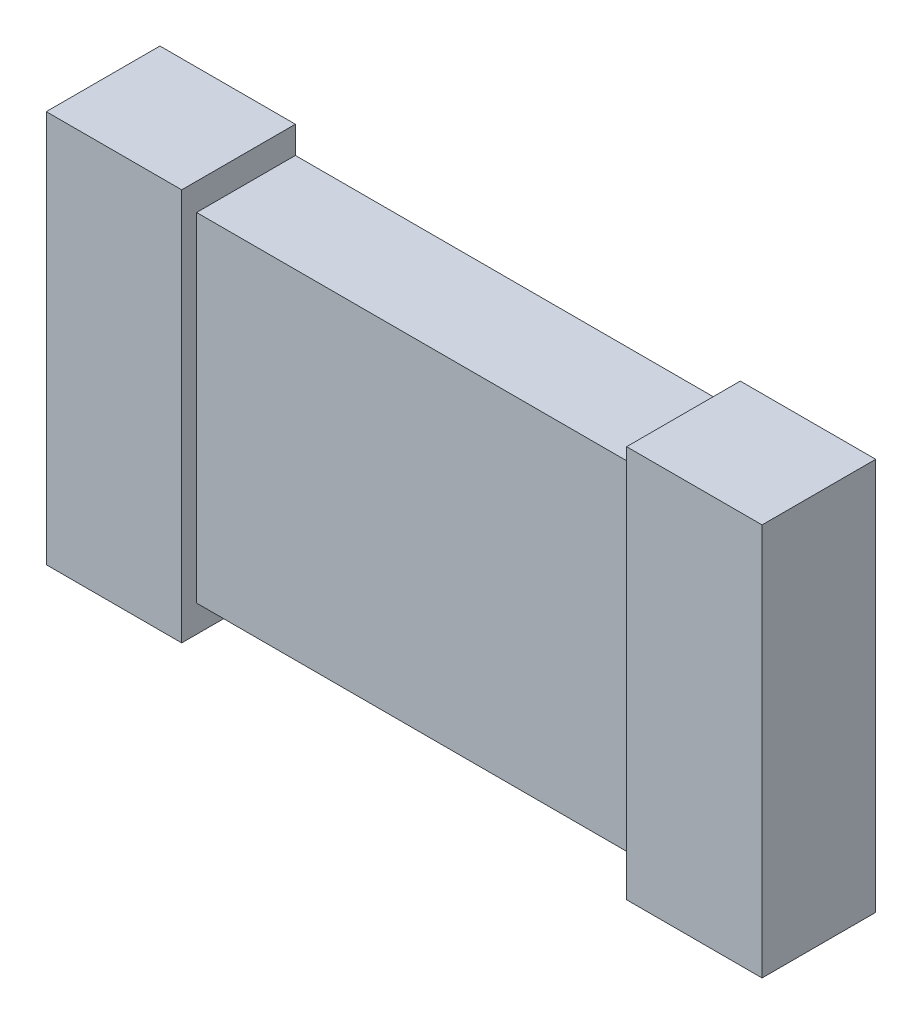
ISO-10303-21;
HEADER;
FILE_DESCRIPTION(('STEP AP214'),'2;1');
FILE_NAME('part.step','',(''),(''),'','','');
FILE_SCHEMA(('AUTOMOTIVE_DESIGN { 1 0 10303 214 1 1 1 1 }'));
ENDSEC;
DATA;
#1=APPLICATION_CONTEXT('core data for automotive mechanical design processes');
#2=APPLICATION_PROTOCOL_DEFINITION('international standard','automotive_design',2000,#1);
#3=PRODUCT_CONTEXT('',#1,'mechanical');
#4=PRODUCT('Part','Part','',(#3));
#5=PRODUCT_RELATED_PRODUCT_CATEGORY('part','',(#4));
#6=PRODUCT_DEFINITION_FORMATION('','',#4);
#7=PRODUCT_DEFINITION_CONTEXT('part definition',#1,'design');
#8=PRODUCT_DEFINITION('design','',#6,#7);
#9=PRODUCT_DEFINITION_SHAPE('','',#8);
#10=(LENGTH_UNIT() NAMED_UNIT(*) SI_UNIT(.MILLI.,.METRE.));
#11=(NAMED_UNIT(*) PLANE_ANGLE_UNIT() SI_UNIT($,.RADIAN.));
#12=(NAMED_UNIT(*) SI_UNIT($,.STERADIAN.) SOLID_ANGLE_UNIT());
#13=UNCERTAINTY_MEASURE_WITH_UNIT(LENGTH_MEASURE(1.E-05),#10,'distance_accuracy_value','');
#14=(GEOMETRIC_REPRESENTATION_CONTEXT(3) GLOBAL_UNCERTAINTY_ASSIGNED_CONTEXT((#13)) GLOBAL_UNIT_ASSIGNED_CONTEXT((#10,
#11,#12)) REPRESENTATION_CONTEXT('',''));
#15=CARTESIAN_POINT('',(0.,0.,0.));
#16=DIRECTION('',(0.,0.,1.));
#17=DIRECTION('',(1.,0.,0.));
#18=AXIS2_PLACEMENT_3D('',#15,#16,#17);
#19=CARTESIAN_POINT('',(50.24063,34.316,-1.6327145543379));
#20=DIRECTION('',(1.,0.,0.));
#21=DIRECTION('',(0.,1.,0.));
#22=AXIS2_PLACEMENT_3D('',#19,#20,#21);
#23=PLANE('',#22);
#24=DIRECTION('',(0.,0.,1.));
#25=VECTOR('',#24,1.);
#26=CARTESIAN_POINT('',(50.24063,33.56,-1.6327145543379));
#27=LINE('',#26,#25);
#28=CARTESIAN_POINT('',(50.24063,33.56,0.5302));
#29=VERTEX_POINT('',#28);
#30=CARTESIAN_POINT('',(50.24063,33.56,0.000999999999999265));
#31=VERTEX_POINT('',#30);
#32=EDGE_CURVE('E133',#29,#31,#27,.F.);
#33=ORIENTED_EDGE('',*,*,#32,.T.);
#34=DIRECTION('',(0.,1.,0.));
#35=VECTOR('',#34,1.);
#36=CARTESIAN_POINT('',(50.24063,34.316,0.000999999999999265));
#37=LINE('',#36,#35);
#38=CARTESIAN_POINT('',(50.24063,33.686,0.000999999999999265));
#39=VERTEX_POINT('',#38);
#40=EDGE_CURVE('E103',#31,#39,#37,.T.);
#41=ORIENTED_EDGE('',*,*,#40,.T.);
#42=DIRECTION('',(0.,0.,1.));
#43=VECTOR('',#42,1.);
#44=CARTESIAN_POINT('',(50.24063,33.686,-1.6327145543379));
#45=LINE('',#44,#43);
#46=CARTESIAN_POINT('',(50.24063,33.686,0.4609));
#47=VERTEX_POINT('',#46);
#48=EDGE_CURVE('E20',#39,#47,#45,.T.);
#49=ORIENTED_EDGE('',*,*,#48,.T.);
#50=DIRECTION('',(0.,1.,0.));
#51=VECTOR('',#50,1.);
#52=CARTESIAN_POINT('',(50.24063,34.316,0.4609));
#53=LINE('',#52,#51);
#54=CARTESIAN_POINT('',(50.24063,35.261,0.4609));
#55=VERTEX_POINT('',#54);
#56=EDGE_CURVE('E108',#47,#55,#53,.T.);
#57=ORIENTED_EDGE('',*,*,#56,.T.);
#58=DIRECTION('',(0.,0.,1.));
#59=VECTOR('',#58,1.);
#60=CARTESIAN_POINT('',(50.24063,35.261,-1.6327145543379));
#61=LINE('',#60,#59);
#62=CARTESIAN_POINT('',(50.24063,35.261,0.000999999999999265));
#63=VERTEX_POINT('',#62);
#64=EDGE_CURVE('E126',#55,#63,#61,.F.);
#65=ORIENTED_EDGE('',*,*,#64,.T.);
#66=DIRECTION('',(0.,1.,0.));
#67=VECTOR('',#66,1.);
#68=CARTESIAN_POINT('',(50.24063,34.316,0.000999999999999265));
#69=LINE('',#68,#67);
#70=CARTESIAN_POINT('',(50.24063,35.387,0.000999999999999265));
#71=VERTEX_POINT('',#70);
#72=EDGE_CURVE('E127',#63,#71,#69,.T.);
#73=ORIENTED_EDGE('',*,*,#72,.T.);
#74=DIRECTION('',(0.,0.,1.));
#75=VECTOR('',#74,1.);
#76=CARTESIAN_POINT('',(50.24063,35.387,-1.6327145543379));
#77=LINE('',#76,#75);
#78=CARTESIAN_POINT('',(50.24063,35.387,0.5302));
#79=VERTEX_POINT('',#78);
#80=EDGE_CURVE('E131',#71,#79,#77,.T.);
#81=ORIENTED_EDGE('',*,*,#80,.T.);
#82=DIRECTION('',(0.,1.,0.));
#83=VECTOR('',#82,1.);
#84=CARTESIAN_POINT('',(50.24063,27.071,0.5302));
#85=LINE('',#84,#83);
#86=EDGE_CURVE('E153',#29,#79,#85,.T.);
#87=ORIENTED_EDGE('',*,*,#86,.F.);
#88=EDGE_LOOP('',(#33,#41,#49,#57,#65,#73,#81,#87));
#89=FACE_BOUND('',#88,.T.);
#90=ADVANCED_FACE('F17',(#89),#23,.T.);
#91=CARTESIAN_POINT('',(52.31207,34.316,0.064));
#92=DIRECTION('',(1.,0.,0.));
#93=DIRECTION('',(0.,1.,0.));
#94=AXIS2_PLACEMENT_3D('',#91,#92,#93);
#95=PLANE('',#94);
#96=DIRECTION('',(0.,1.,0.));
#97=VECTOR('',#96,1.);
#98=CARTESIAN_POINT('',(52.31207,34.316,0.000999999999999265));
#99=LINE('',#98,#97);
#100=CARTESIAN_POINT('',(52.31207,33.56,0.000999999999999265));
#101=VERTEX_POINT('',#100);
#102=CARTESIAN_POINT('',(52.31207,33.686,0.000999999999999265));
#103=VERTEX_POINT('',#102);
#104=EDGE_CURVE('E149',#101,#103,#99,.T.);
#105=ORIENTED_EDGE('',*,*,#104,.F.);
#106=DIRECTION('',(0.,0.,1.));
#107=VECTOR('',#106,1.);
#108=CARTESIAN_POINT('',(52.31207,33.56,0.064));
#109=LINE('',#108,#107);
#110=CARTESIAN_POINT('',(52.31207,33.56,0.5302));
#111=VERTEX_POINT('',#110);
#112=EDGE_CURVE('E146',#111,#101,#109,.F.);
#113=ORIENTED_EDGE('',*,*,#112,.F.);
#114=DIRECTION('',(0.,1.,0.));
#115=VECTOR('',#114,1.);
#116=CARTESIAN_POINT('',(52.31207,27.071,0.5302));
#117=LINE('',#116,#115);
#118=CARTESIAN_POINT('',(52.31207,35.387,0.5302));
#119=VERTEX_POINT('',#118);
#120=EDGE_CURVE('E159',#119,#111,#117,.F.);
#121=ORIENTED_EDGE('',*,*,#120,.F.);
#122=DIRECTION('',(0.,0.,1.));
#123=VECTOR('',#122,1.);
#124=CARTESIAN_POINT('',(52.31207,35.387,0.064));
#125=LINE('',#124,#123);
#126=CARTESIAN_POINT('',(52.31207,35.387,0.000999999999999265));
#127=VERTEX_POINT('',#126);
#128=EDGE_CURVE('E144',#127,#119,#125,.T.);
#129=ORIENTED_EDGE('',*,*,#128,.F.);
#130=DIRECTION('',(0.,1.,0.));
#131=VECTOR('',#130,1.);
#132=CARTESIAN_POINT('',(52.31207,34.316,0.000999999999999265));
#133=LINE('',#132,#131);
#134=CARTESIAN_POINT('',(52.31207,35.261,0.000999999999999265));
#135=VERTEX_POINT('',#134);
#136=EDGE_CURVE('E141',#135,#127,#133,.T.);
#137=ORIENTED_EDGE('',*,*,#136,.F.);
#138=DIRECTION('',(0.,0.,1.));
#139=VECTOR('',#138,1.);
#140=CARTESIAN_POINT('',(52.31207,35.261,0.064));
#141=LINE('',#140,#139);
#142=CARTESIAN_POINT('',(52.31207,35.261,0.4609));
#143=VERTEX_POINT('',#142);
#144=EDGE_CURVE('E138',#143,#135,#141,.F.);
#145=ORIENTED_EDGE('',*,*,#144,.F.);
#146=DIRECTION('',(0.,1.,0.));
#147=VECTOR('',#146,1.);
#148=CARTESIAN_POINT('',(52.31207,34.316,0.4609));
#149=LINE('',#148,#147);
#150=CARTESIAN_POINT('',(52.31207,33.686,0.4609));
#151=VERTEX_POINT('',#150);
#152=EDGE_CURVE('E136',#151,#143,#149,.T.);
#153=ORIENTED_EDGE('',*,*,#152,.F.);
#154=DIRECTION('',(0.,0.,1.));
#155=VECTOR('',#154,1.);
#156=CARTESIAN_POINT('',(52.31207,33.686,0.064));
#157=LINE('',#156,#155);
#158=EDGE_CURVE('E116',#103,#151,#157,.T.);
#159=ORIENTED_EDGE('',*,*,#158,.F.);
#160=EDGE_LOOP('',(#105,#113,#121,#129,#137,#145,#153,#159));
#161=FACE_BOUND('',#160,.T.);
#162=ADVANCED_FACE('F205',(#161),#95,.F.);
#163=CARTESIAN_POINT('',(62.21,27.071,0.5302));
#164=DIRECTION('',(0.,0.,1.));
#165=DIRECTION('',(1.,0.,0.));
#166=AXIS2_PLACEMENT_3D('',#163,#164,#165);
#167=PLANE('',#166);
#168=DIRECTION('',(0.,-1.,0.));
#169=VECTOR('',#168,1.);
#170=CARTESIAN_POINT('',(49.61,34.316,0.5302));
#171=LINE('',#170,#169);
#172=CARTESIAN_POINT('',(49.61,33.56,0.5302));
#173=VERTEX_POINT('',#172);
#174=CARTESIAN_POINT('',(49.61,35.387,0.5302));
#175=VERTEX_POINT('',#174);
#176=EDGE_CURVE('E168',#173,#175,#171,.F.);
#177=ORIENTED_EDGE('',*,*,#176,.F.);
#178=DIRECTION('',(1.,0.,0.));
#179=VECTOR('',#178,1.);
#180=CARTESIAN_POINT('',(62.21,33.56,0.5302));
#181=LINE('',#180,#179);
#182=EDGE_CURVE('E156',#173,#29,#181,.T.);
#183=ORIENTED_EDGE('',*,*,#182,.T.);
#184=ORIENTED_EDGE('',*,*,#86,.T.);
#185=DIRECTION('',(-1.,0.,0.));
#186=VECTOR('',#185,1.);
#187=CARTESIAN_POINT('',(51.185,35.387,0.5302));
#188=LINE('',#187,#186);
#189=EDGE_CURVE('E165',#175,#79,#188,.F.);
#190=ORIENTED_EDGE('',*,*,#189,.F.);
#191=EDGE_LOOP('',(#177,#183,#184,#190));
#192=FACE_BOUND('',#191,.T.);
#193=ADVANCED_FACE('F260',(#192),#167,.T.);
#194=CARTESIAN_POINT('',(62.21,27.071,0.5302));
#195=DIRECTION('',(0.,0.,1.));
#196=DIRECTION('',(1.,0.,0.));
#197=AXIS2_PLACEMENT_3D('',#194,#195,#196);
#198=PLANE('',#197);
#199=DIRECTION('',(0.,1.,0.));
#200=VECTOR('',#199,1.);
#201=CARTESIAN_POINT('',(52.9427,34.316,0.5302));
#202=LINE('',#201,#200);
#203=CARTESIAN_POINT('',(52.9427,35.387,0.5302));
#204=VERTEX_POINT('',#203);
#205=CARTESIAN_POINT('',(52.9427,33.56,0.5302));
#206=VERTEX_POINT('',#205);
#207=EDGE_CURVE('E175',#204,#206,#202,.F.);
#208=ORIENTED_EDGE('',*,*,#207,.F.);
#209=DIRECTION('',(1.,0.,0.));
#210=VECTOR('',#209,1.);
#211=CARTESIAN_POINT('',(62.21,35.387,0.5302));
#212=LINE('',#211,#210);
#213=EDGE_CURVE('E162',#204,#119,#212,.F.);
#214=ORIENTED_EDGE('',*,*,#213,.T.);
#215=ORIENTED_EDGE('',*,*,#120,.T.);
#216=DIRECTION('',(1.,0.,0.));
#217=VECTOR('',#216,1.);
#218=CARTESIAN_POINT('',(51.185,33.56,0.5302));
#219=LINE('',#218,#217);
#220=EDGE_CURVE('E119',#206,#111,#219,.F.);
#221=ORIENTED_EDGE('',*,*,#220,.F.);
#222=EDGE_LOOP('',(#208,#214,#215,#221));
#223=FACE_BOUND('',#222,.T.);
#224=ADVANCED_FACE('F210',(#223),#198,.T.);
#225=CARTESIAN_POINT('',(62.21,27.071,0.4609));
#226=DIRECTION('',(0.,0.,1.));
#227=DIRECTION('',(1.,0.,0.));
#228=AXIS2_PLACEMENT_3D('',#225,#226,#227);
#229=PLANE('',#228);
#230=ORIENTED_EDGE('',*,*,#152,.T.);
#231=DIRECTION('',(-1.,0.,0.));
#232=VECTOR('',#231,1.);
#233=CARTESIAN_POINT('',(51.185,35.261,0.4609));
#234=LINE('',#233,#232);
#235=EDGE_CURVE('E124',#55,#143,#234,.F.);
#236=ORIENTED_EDGE('',*,*,#235,.F.);
#237=ORIENTED_EDGE('',*,*,#56,.F.);
#238=DIRECTION('',(1.,0.,0.));
#239=VECTOR('',#238,1.);
#240=CARTESIAN_POINT('',(51.185,33.686,0.4609));
#241=LINE('',#240,#239);
#242=EDGE_CURVE('E114',#151,#47,#241,.F.);
#243=ORIENTED_EDGE('',*,*,#242,.F.);
#244=EDGE_LOOP('',(#230,#236,#237,#243));
#245=FACE_BOUND('',#244,.T.);
#246=ADVANCED_FACE('F122',(#245),#229,.T.);
#247=CARTESIAN_POINT('',(51.185,35.387,0.127));
#248=DIRECTION('',(0.,1.,0.));
#249=DIRECTION('',(-1.,0.,0.));
#250=AXIS2_PLACEMENT_3D('',#247,#248,#249);
#251=PLANE('',#250);
#252=DIRECTION('',(0.,0.,1.));
#253=VECTOR('',#252,1.);
#254=CARTESIAN_POINT('',(49.61,35.387,0.127));
#255=LINE('',#254,#253);
#256=CARTESIAN_POINT('',(49.61,35.387,0.000999999999999265));
#257=VERTEX_POINT('',#256);
#258=EDGE_CURVE('E170',#175,#257,#255,.F.);
#259=ORIENTED_EDGE('',*,*,#258,.F.);
#260=ORIENTED_EDGE('',*,*,#189,.T.);
#261=ORIENTED_EDGE('',*,*,#80,.F.);
#262=DIRECTION('',(1.,0.,0.));
#263=VECTOR('',#262,1.);
#264=CARTESIAN_POINT('',(62.21,35.387,0.000999999999999265));
#265=LINE('',#264,#263);
#266=EDGE_CURVE('E181',#71,#257,#265,.F.);
#267=ORIENTED_EDGE('',*,*,#266,.T.);
#268=EDGE_LOOP('',(#259,#260,#261,#267));
#269=FACE_BOUND('',#268,.T.);
#270=ADVANCED_FACE('F228',(#269),#251,.T.);
#271=CARTESIAN_POINT('',(49.61,34.316,0.127));
#272=DIRECTION('',(-1.,0.,0.));
#273=DIRECTION('',(0.,-1.,0.));
#274=AXIS2_PLACEMENT_3D('',#271,#272,#273);
#275=PLANE('',#274);
#276=ORIENTED_EDGE('',*,*,#176,.T.);
#277=ORIENTED_EDGE('',*,*,#258,.T.);
#278=DIRECTION('',(0.,1.,0.));
#279=VECTOR('',#278,1.);
#280=CARTESIAN_POINT('',(49.61,27.071,0.000999999999999265));
#281=LINE('',#280,#279);
#282=CARTESIAN_POINT('',(49.61,33.56,0.000999999999999265));
#283=VERTEX_POINT('',#282);
#284=EDGE_CURVE('E184',#257,#283,#281,.F.);
#285=ORIENTED_EDGE('',*,*,#284,.T.);
#286=DIRECTION('',(0.,0.,1.));
#287=VECTOR('',#286,1.);
#288=CARTESIAN_POINT('',(49.61,33.56,0.127));
#289=LINE('',#288,#287);
#290=EDGE_CURVE('E120',#173,#283,#289,.F.);
#291=ORIENTED_EDGE('',*,*,#290,.F.);
#292=EDGE_LOOP('',(#276,#277,#285,#291));
#293=FACE_BOUND('',#292,.T.);
#294=ADVANCED_FACE('F223',(#293),#275,.T.);
#295=CARTESIAN_POINT('',(51.185,33.56,0.127));
#296=DIRECTION('',(0.,-1.,0.));
#297=DIRECTION('',(1.,0.,0.));
#298=AXIS2_PLACEMENT_3D('',#295,#296,#297);
#299=PLANE('',#298);
#300=ORIENTED_EDGE('',*,*,#290,.T.);
#301=DIRECTION('',(1.,0.,0.));
#302=VECTOR('',#301,1.);
#303=CARTESIAN_POINT('',(62.21,33.56,0.000999999999999265));
#304=LINE('',#303,#302);
#305=EDGE_CURVE('E187',#283,#31,#304,.T.);
#306=ORIENTED_EDGE('',*,*,#305,.T.);
#307=ORIENTED_EDGE('',*,*,#32,.F.);
#308=ORIENTED_EDGE('',*,*,#182,.F.);
#309=EDGE_LOOP('',(#300,#306,#307,#308));
#310=FACE_BOUND('',#309,.T.);
#311=ADVANCED_FACE('F249',(#310),#299,.T.);
#312=CARTESIAN_POINT('',(51.185,33.686,0.127));
#313=DIRECTION('',(0.,-1.,0.));
#314=DIRECTION('',(1.,0.,0.));
#315=AXIS2_PLACEMENT_3D('',#312,#313,#314);
#316=PLANE('',#315);
#317=ORIENTED_EDGE('',*,*,#48,.F.);
#318=DIRECTION('',(1.,0.,0.));
#319=VECTOR('',#318,1.);
#320=CARTESIAN_POINT('',(62.21,33.686,0.000999999999999265));
#321=LINE('',#320,#319);
#322=EDGE_CURVE('E190',#39,#103,#321,.T.);
#323=ORIENTED_EDGE('',*,*,#322,.T.);
#324=ORIENTED_EDGE('',*,*,#158,.T.);
#325=ORIENTED_EDGE('',*,*,#242,.T.);
#326=EDGE_LOOP('',(#317,#323,#324,#325));
#327=FACE_BOUND('',#326,.T.);
#328=ADVANCED_FACE('F115',(#327),#316,.T.);
#329=CARTESIAN_POINT('',(51.185,33.56,0.127));
#330=DIRECTION('',(0.,-1.,0.));
#331=DIRECTION('',(1.,0.,0.));
#332=AXIS2_PLACEMENT_3D('',#329,#330,#331);
#333=PLANE('',#332);
#334=DIRECTION('',(0.,0.,1.));
#335=VECTOR('',#334,1.);
#336=CARTESIAN_POINT('',(52.9427,33.56,0.127));
#337=LINE('',#336,#335);
#338=CARTESIAN_POINT('',(52.9427,33.56,0.000999999999999265));
#339=VERTEX_POINT('',#338);
#340=EDGE_CURVE('E177',#206,#339,#337,.F.);
#341=ORIENTED_EDGE('',*,*,#340,.F.);
#342=ORIENTED_EDGE('',*,*,#220,.T.);
#343=ORIENTED_EDGE('',*,*,#112,.T.);
#344=DIRECTION('',(1.,0.,0.));
#345=VECTOR('',#344,1.);
#346=CARTESIAN_POINT('',(62.21,33.56,0.000999999999999265));
#347=LINE('',#346,#345);
#348=EDGE_CURVE('E192',#101,#339,#347,.T.);
#349=ORIENTED_EDGE('',*,*,#348,.T.);
#350=EDGE_LOOP('',(#341,#342,#343,#349));
#351=FACE_BOUND('',#350,.T.);
#352=ADVANCED_FACE('F213',(#351),#333,.T.);
#353=CARTESIAN_POINT('',(52.9427,34.316,0.127));
#354=DIRECTION('',(1.,0.,0.));
#355=DIRECTION('',(0.,1.,0.));
#356=AXIS2_PLACEMENT_3D('',#353,#354,#355);
#357=PLANE('',#356);
#358=ORIENTED_EDGE('',*,*,#207,.T.);
#359=ORIENTED_EDGE('',*,*,#340,.T.);
#360=DIRECTION('',(0.,1.,0.));
#361=VECTOR('',#360,1.);
#362=CARTESIAN_POINT('',(52.9427,27.071,0.000999999999999265));
#363=LINE('',#362,#361);
#364=CARTESIAN_POINT('',(52.9427,35.387,0.000999999999999265));
#365=VERTEX_POINT('',#364);
#366=EDGE_CURVE('E195',#339,#365,#363,.T.);
#367=ORIENTED_EDGE('',*,*,#366,.T.);
#368=DIRECTION('',(0.,0.,1.));
#369=VECTOR('',#368,1.);
#370=CARTESIAN_POINT('',(52.9427,35.387,0.127));
#371=LINE('',#370,#369);
#372=EDGE_CURVE('E35',#204,#365,#371,.F.);
#373=ORIENTED_EDGE('',*,*,#372,.F.);
#374=EDGE_LOOP('',(#358,#359,#367,#373));
#375=FACE_BOUND('',#374,.T.);
#376=ADVANCED_FACE('F216',(#375),#357,.T.);
#377=CARTESIAN_POINT('',(51.185,35.387,0.127));
#378=DIRECTION('',(0.,1.,0.));
#379=DIRECTION('',(-1.,0.,0.));
#380=AXIS2_PLACEMENT_3D('',#377,#378,#379);
#381=PLANE('',#380);
#382=ORIENTED_EDGE('',*,*,#372,.T.);
#383=DIRECTION('',(1.,0.,0.));
#384=VECTOR('',#383,1.);
#385=CARTESIAN_POINT('',(62.21,35.387,0.000999999999999265));
#386=LINE('',#385,#384);
#387=EDGE_CURVE('E26',#365,#127,#386,.F.);
#388=ORIENTED_EDGE('',*,*,#387,.T.);
#389=ORIENTED_EDGE('',*,*,#128,.T.);
#390=ORIENTED_EDGE('',*,*,#213,.F.);
#391=EDGE_LOOP('',(#382,#388,#389,#390));
#392=FACE_BOUND('',#391,.T.);
#393=ADVANCED_FACE('F198',(#392),#381,.T.);
#394=CARTESIAN_POINT('',(51.185,35.261,0.127));
#395=DIRECTION('',(0.,1.,0.));
#396=DIRECTION('',(-1.,0.,0.));
#397=AXIS2_PLACEMENT_3D('',#394,#395,#396);
#398=PLANE('',#397);
#399=ORIENTED_EDGE('',*,*,#64,.F.);
#400=ORIENTED_EDGE('',*,*,#235,.T.);
#401=ORIENTED_EDGE('',*,*,#144,.T.);
#402=DIRECTION('',(1.,0.,0.));
#403=VECTOR('',#402,1.);
#404=CARTESIAN_POINT('',(62.21,35.261,0.000999999999999265));
#405=LINE('',#404,#403);
#406=EDGE_CURVE('E11',#135,#63,#405,.F.);
#407=ORIENTED_EDGE('',*,*,#406,.T.);
#408=EDGE_LOOP('',(#399,#400,#401,#407));
#409=FACE_BOUND('',#408,.T.);
#410=ADVANCED_FACE('F232',(#409),#398,.T.);
#411=CARTESIAN_POINT('',(62.21,27.071,0.000999999999999265));
#412=DIRECTION('',(0.,0.,1.));
#413=DIRECTION('',(1.,0.,0.));
#414=AXIS2_PLACEMENT_3D('',#411,#412,#413);
#415=PLANE('',#414);
#416=ORIENTED_EDGE('',*,*,#406,.F.);
#417=ORIENTED_EDGE('',*,*,#136,.T.);
#418=ORIENTED_EDGE('',*,*,#387,.F.);
#419=ORIENTED_EDGE('',*,*,#366,.F.);
#420=ORIENTED_EDGE('',*,*,#348,.F.);
#421=ORIENTED_EDGE('',*,*,#104,.T.);
#422=ORIENTED_EDGE('',*,*,#322,.F.);
#423=ORIENTED_EDGE('',*,*,#40,.F.);
#424=ORIENTED_EDGE('',*,*,#305,.F.);
#425=ORIENTED_EDGE('',*,*,#284,.F.);
#426=ORIENTED_EDGE('',*,*,#266,.F.);
#427=ORIENTED_EDGE('',*,*,#72,.F.);
#428=EDGE_LOOP('',(#416,#417,#418,#419,#420,#421,#422,#423,#424,#425,#426,#427));
#429=FACE_BOUND('',#428,.T.);
#430=ADVANCED_FACE('F202',(#429),#415,.F.);
#431=CLOSED_SHELL('',(#90,#162,#193,#224,#246,#270,#294,#311,#328,#352,#376,#393,#410,#430));
#432=MANIFOLD_SOLID_BREP('B1',#431);
#433=ADVANCED_BREP_SHAPE_REPRESENTATION('',(#18,#432),#14);
#434=SHAPE_DEFINITION_REPRESENTATION(#9,#433);
ENDSEC;
END-ISO-10303-21;
